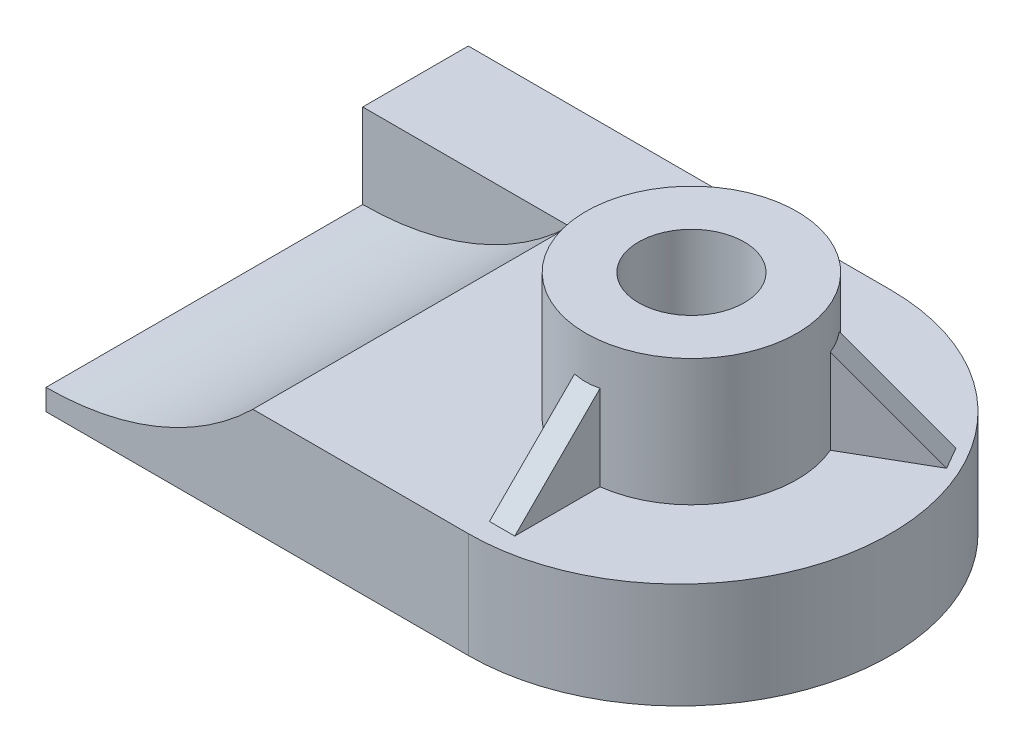
ISO-10303-21;
HEADER;
FILE_DESCRIPTION(('STEP AP214'),'2;1');
FILE_NAME('part.step','',(''),(''),'','','');
FILE_SCHEMA(('AUTOMOTIVE_DESIGN { 1 0 10303 214 1 1 1 1 }'));
ENDSEC;
DATA;
#1=APPLICATION_CONTEXT('core data for automotive mechanical design processes');
#2=APPLICATION_PROTOCOL_DEFINITION('international standard','automotive_design',2000,#1);
#3=PRODUCT_CONTEXT('',#1,'mechanical');
#4=PRODUCT('Part','Part','',(#3));
#5=PRODUCT_RELATED_PRODUCT_CATEGORY('part','',(#4));
#6=PRODUCT_DEFINITION_FORMATION('','',#4);
#7=PRODUCT_DEFINITION_CONTEXT('part definition',#1,'design');
#8=PRODUCT_DEFINITION('design','',#6,#7);
#9=PRODUCT_DEFINITION_SHAPE('','',#8);
#10=(LENGTH_UNIT() NAMED_UNIT(*) SI_UNIT(.MILLI.,.METRE.));
#11=(NAMED_UNIT(*) PLANE_ANGLE_UNIT() SI_UNIT($,.RADIAN.));
#12=(NAMED_UNIT(*) SI_UNIT($,.STERADIAN.) SOLID_ANGLE_UNIT());
#13=UNCERTAINTY_MEASURE_WITH_UNIT(LENGTH_MEASURE(1.E-05),#10,'distance_accuracy_value','');
#14=(GEOMETRIC_REPRESENTATION_CONTEXT(3) GLOBAL_UNCERTAINTY_ASSIGNED_CONTEXT((#13)) GLOBAL_UNIT_ASSIGNED_CONTEXT((#10,
#11,#12)) REPRESENTATION_CONTEXT('',''));
#15=CARTESIAN_POINT('',(0.,0.,0.));
#16=DIRECTION('',(0.,0.,1.));
#17=DIRECTION('',(1.,0.,0.));
#18=AXIS2_PLACEMENT_3D('',#15,#16,#17);
#19=CARTESIAN_POINT('',(50.,25.,0.));
#20=DIRECTION('',(0.,-1.,0.));
#21=DIRECTION('',(0.,0.,-1.));
#22=AXIS2_PLACEMENT_3D('',#19,#20,#21);
#23=CYLINDRICAL_SURFACE('',#22,50.);
#24=CARTESIAN_POINT('',(50.,0.,0.));
#25=DIRECTION('',(0.,1.,0.));
#26=DIRECTION('',(0.,0.,-1.));
#27=AXIS2_PLACEMENT_3D('',#24,#25,#26);
#28=CIRCLE('',#27,50.);
#29=CARTESIAN_POINT('',(50.,0.,50.));
#30=VERTEX_POINT('',#29);
#31=CARTESIAN_POINT('',(50.,0.,-50.));
#32=VERTEX_POINT('',#31);
#33=EDGE_CURVE('E261',#30,#32,#28,.T.);
#34=ORIENTED_EDGE('',*,*,#33,.T.);
#35=DIRECTION('',(0.,-1.,0.));
#36=VECTOR('',#35,1.);
#37=CARTESIAN_POINT('',(50.,25.,-50.));
#38=LINE('',#37,#36);
#39=CARTESIAN_POINT('',(50.,25.,-50.));
#40=VERTEX_POINT('',#39);
#41=EDGE_CURVE('E301',#40,#32,#38,.T.);
#42=ORIENTED_EDGE('',*,*,#41,.F.);
#43=CARTESIAN_POINT('',(50.,25.,0.));
#44=DIRECTION('',(0.,1.,0.));
#45=DIRECTION('',(0.,0.,-1.));
#46=AXIS2_PLACEMENT_3D('',#43,#44,#45);
#47=CIRCLE('',#46,50.);
#48=CARTESIAN_POINT('',(50.,25.,50.));
#49=VERTEX_POINT('',#48);
#50=EDGE_CURVE('E265',#49,#40,#47,.T.);
#51=ORIENTED_EDGE('',*,*,#50,.F.);
#52=DIRECTION('',(0.,-1.,0.));
#53=VECTOR('',#52,1.);
#54=CARTESIAN_POINT('',(50.,25.,50.));
#55=LINE('',#54,#53);
#56=EDGE_CURVE('E279',#49,#30,#55,.T.);
#57=ORIENTED_EDGE('',*,*,#56,.T.);
#58=EDGE_LOOP('',(#34,#42,#51,#57));
#59=FACE_BOUND('',#58,.T.);
#60=ADVANCED_FACE('F39',(#59),#23,.T.);
#61=CARTESIAN_POINT('',(-50.,25.,-50.));
#62=DIRECTION('',(0.,0.,1.));
#63=DIRECTION('',(1.,0.,0.));
#64=AXIS2_PLACEMENT_3D('',#61,#62,#63);
#65=PLANE('',#64);
#66=DIRECTION('',(-1.,0.,0.));
#67=VECTOR('',#66,1.);
#68=CARTESIAN_POINT('',(-50.,0.,-50.));
#69=LINE('',#68,#67);
#70=CARTESIAN_POINT('',(-50.,0.,-50.));
#71=VERTEX_POINT('',#70);
#72=EDGE_CURVE('E282',#32,#71,#69,.T.);
#73=ORIENTED_EDGE('',*,*,#72,.T.);
#74=DIRECTION('',(0.,-1.,0.));
#75=VECTOR('',#74,1.);
#76=CARTESIAN_POINT('',(-50.,25.,-50.));
#77=LINE('',#76,#75);
#78=CARTESIAN_POINT('',(-50.,25.,-50.));
#79=VERTEX_POINT('',#78);
#80=EDGE_CURVE('E297',#79,#71,#77,.T.);
#81=ORIENTED_EDGE('',*,*,#80,.F.);
#82=DIRECTION('',(-1.,0.,0.));
#83=VECTOR('',#82,1.);
#84=CARTESIAN_POINT('',(-50.,25.,-50.));
#85=LINE('',#84,#83);
#86=EDGE_CURVE('E268',#40,#79,#85,.T.);
#87=ORIENTED_EDGE('',*,*,#86,.F.);
#88=ORIENTED_EDGE('',*,*,#41,.T.);
#89=EDGE_LOOP('',(#73,#81,#87,#88));
#90=FACE_BOUND('',#89,.T.);
#91=ADVANCED_FACE('F332',(#90),#65,.F.);
#92=CARTESIAN_POINT('',(-50.,25.,-50.));
#93=DIRECTION('',(1.,0.,0.));
#94=DIRECTION('',(0.,0.,-1.));
#95=AXIS2_PLACEMENT_3D('',#92,#93,#94);
#96=PLANE('',#95);
#97=DIRECTION('',(0.,-1.,0.));
#98=VECTOR('',#97,1.);
#99=CARTESIAN_POINT('',(-50.,25.,50.));
#100=LINE('',#99,#98);
#101=CARTESIAN_POINT('',(-50.,5.,50.));
#102=VERTEX_POINT('',#101);
#103=CARTESIAN_POINT('',(-50.,0.,50.));
#104=VERTEX_POINT('',#103);
#105=EDGE_CURVE('E294',#102,#104,#100,.T.);
#106=ORIENTED_EDGE('',*,*,#105,.F.);
#107=DIRECTION('',(0.,0.,1.));
#108=VECTOR('',#107,1.);
#109=CARTESIAN_POINT('',(-50.,5.,-25.));
#110=LINE('',#109,#108);
#111=CARTESIAN_POINT('',(-50.,5.,-25.));
#112=VERTEX_POINT('',#111);
#113=EDGE_CURVE('E258',#112,#102,#110,.T.);
#114=ORIENTED_EDGE('',*,*,#113,.F.);
#115=DIRECTION('',(0.,-1.,0.));
#116=VECTOR('',#115,1.);
#117=CARTESIAN_POINT('',(-50.,25.,-25.));
#118=LINE('',#117,#116);
#119=CARTESIAN_POINT('',(-50.,25.,-25.));
#120=VERTEX_POINT('',#119);
#121=EDGE_CURVE('E251',#120,#112,#118,.T.);
#122=ORIENTED_EDGE('',*,*,#121,.F.);
#123=DIRECTION('',(0.,0.,1.));
#124=VECTOR('',#123,1.);
#125=CARTESIAN_POINT('',(-50.,25.,-50.));
#126=LINE('',#125,#124);
#127=EDGE_CURVE('E272',#79,#120,#126,.T.);
#128=ORIENTED_EDGE('',*,*,#127,.F.);
#129=ORIENTED_EDGE('',*,*,#80,.T.);
#130=DIRECTION('',(0.,0.,1.));
#131=VECTOR('',#130,1.);
#132=CARTESIAN_POINT('',(-50.,0.,-50.));
#133=LINE('',#132,#131);
#134=EDGE_CURVE('E285',#71,#104,#133,.T.);
#135=ORIENTED_EDGE('',*,*,#134,.T.);
#136=EDGE_LOOP('',(#106,#114,#122,#128,#129,#135));
#137=FACE_BOUND('',#136,.T.);
#138=ADVANCED_FACE('F337',(#137),#96,.F.);
#139=CARTESIAN_POINT('',(-50.,25.,50.));
#140=DIRECTION('',(0.,0.,-1.));
#141=DIRECTION('',(-1.,0.,0.));
#142=AXIS2_PLACEMENT_3D('',#139,#140,#141);
#143=PLANE('',#142);
#144=DIRECTION('',(1.,0.,0.));
#145=VECTOR('',#144,1.);
#146=CARTESIAN_POINT('',(-50.,0.,50.));
#147=LINE('',#146,#145);
#148=EDGE_CURVE('E269',#104,#30,#147,.T.);
#149=ORIENTED_EDGE('',*,*,#148,.T.);
#150=ORIENTED_EDGE('',*,*,#56,.F.);
#151=DIRECTION('',(1.,0.,0.));
#152=VECTOR('',#151,1.);
#153=CARTESIAN_POINT('',(-50.,25.,50.));
#154=LINE('',#153,#152);
#155=CARTESIAN_POINT('',(-1.01020514433643,25.,50.));
#156=VERTEX_POINT('',#155);
#157=EDGE_CURVE('E276',#156,#49,#154,.T.);
#158=ORIENTED_EDGE('',*,*,#157,.F.);
#159=CARTESIAN_POINT('',(-50.,75.,50.));
#160=DIRECTION('',(0.,0.,1.));
#161=DIRECTION('',(1.,0.,0.));
#162=AXIS2_PLACEMENT_3D('',#159,#160,#161);
#163=CIRCLE('',#162,70.);
#164=EDGE_CURVE('E244',#102,#156,#163,.T.);
#165=ORIENTED_EDGE('',*,*,#164,.F.);
#166=ORIENTED_EDGE('',*,*,#105,.T.);
#167=EDGE_LOOP('',(#149,#150,#158,#165,#166));
#168=FACE_BOUND('',#167,.T.);
#169=ADVANCED_FACE('F356',(#168),#143,.F.);
#170=CARTESIAN_POINT('',(50.,25.,0.));
#171=DIRECTION('',(0.,-1.,0.));
#172=DIRECTION('',(0.,0.,-1.));
#173=AXIS2_PLACEMENT_3D('',#170,#171,#172);
#174=PLANE('',#173);
#175=DIRECTION('',(0.866025403784436,0.,-0.500000000000004));
#176=VECTOR('',#175,1.);
#177=CARTESIAN_POINT('',(52.1292136145049,25.,3.6879061604898));
#178=LINE('',#177,#176);
#179=CARTESIAN_POINT('',(75.7690122011827,25.,-9.96053791711731));
#180=VERTEX_POINT('',#179);
#181=CARTESIAN_POINT('',(93.2295703993094,25.,-20.041395893007));
#182=VERTEX_POINT('',#181);
#183=EDGE_CURVE('E191',#180,#182,#178,.T.);
#184=ORIENTED_EDGE('',*,*,#183,.F.);
#185=CARTESIAN_POINT('',(52.8389514860065,25.,0.));
#186=DIRECTION('',(0.,-1.,0.));
#187=DIRECTION('',(0.,0.,-1.));
#188=AXIS2_PLACEMENT_3D('',#185,#186,#187);
#189=CIRCLE('',#188,25.);
#190=CARTESIAN_POINT('',(56.,25.,24.7993502393143));
#191=VERTEX_POINT('',#190);
#192=EDGE_CURVE('E153',#191,#180,#189,.F.);
#193=ORIENTED_EDGE('',*,*,#192,.F.);
#194=DIRECTION('',(0.,0.,1.));
#195=VECTOR('',#194,1.);
#196=CARTESIAN_POINT('',(56.,25.,0.));
#197=LINE('',#196,#195);
#198=CARTESIAN_POINT('',(56.,25.,45.));
#199=VERTEX_POINT('',#198);
#200=EDGE_CURVE('E223',#191,#199,#197,.T.);
#201=ORIENTED_EDGE('',*,*,#200,.T.);
#202=DIRECTION('',(-1.,0.,0.));
#203=VECTOR('',#202,1.);
#204=CARTESIAN_POINT('',(50.,25.,45.));
#205=LINE('',#204,#203);
#206=CARTESIAN_POINT('',(50.,25.,45.));
#207=VERTEX_POINT('',#206);
#208=EDGE_CURVE('E226',#199,#207,#205,.T.);
#209=ORIENTED_EDGE('',*,*,#208,.T.);
#210=DIRECTION('',(0.,0.,1.));
#211=VECTOR('',#210,1.);
#212=CARTESIAN_POINT('',(50.,25.,0.));
#213=LINE('',#212,#211);
#214=CARTESIAN_POINT('',(50.,25.,24.8382840482208));
#215=VERTEX_POINT('',#214);
#216=EDGE_CURVE('E215',#215,#207,#213,.T.);
#217=ORIENTED_EDGE('',*,*,#216,.F.);
#218=CARTESIAN_POINT('',(29.7815599244157,25.,-9.6621268039435));
#219=VERTEX_POINT('',#218);
#220=EDGE_CURVE('E154',#219,#215,#189,.F.);
#221=ORIENTED_EDGE('',*,*,#220,.F.);
#222=DIRECTION('',(-0.866025403784443,0.,-0.499999999999992));
#223=VECTOR('',#222,1.);
#224=CARTESIAN_POINT('',(49.1292136145049,25.,1.50824626221687));
#225=LINE('',#224,#223);
#226=CARTESIAN_POINT('',(12.2872840587098,25.,-19.7624516842862));
#227=VERTEX_POINT('',#226);
#228=EDGE_CURVE('E54',#219,#227,#225,.T.);
#229=ORIENTED_EDGE('',*,*,#228,.T.);
#230=DIRECTION('',(0.499999999999992,0.,-0.866025403784443));
#231=VECTOR('',#230,1.);
#232=CARTESIAN_POINT('',(13.1580704442049,25.,-21.2706979465031));
#233=LINE('',#232,#231);
#234=CARTESIAN_POINT('',(15.2872840587098,25.,-24.9586041069928));
#235=VERTEX_POINT('',#234);
#236=EDGE_CURVE('E58',#227,#235,#233,.T.);
#237=ORIENTED_EDGE('',*,*,#236,.T.);
#238=DIRECTION('',(-0.866025403784443,0.,-0.499999999999992));
#239=VECTOR('',#238,1.);
#240=CARTESIAN_POINT('',(52.1292136145048,25.,-3.68790616048979));
#241=LINE('',#240,#239);
#242=CARTESIAN_POINT('',(32.7478422568366,25.,-14.8777461311034));
#243=VERTEX_POINT('',#242);
#244=EDGE_CURVE('E156',#243,#235,#241,.T.);
#245=ORIENTED_EDGE('',*,*,#244,.F.);
#246=CARTESIAN_POINT('',(72.7352945336036,25.,-15.1372234353707));
#247=VERTEX_POINT('',#246);
#248=EDGE_CURVE('E144',#247,#243,#189,.F.);
#249=ORIENTED_EDGE('',*,*,#248,.F.);
#250=DIRECTION('',(0.866025403784436,0.,-0.500000000000004));
#251=VECTOR('',#250,1.);
#252=CARTESIAN_POINT('',(49.1292136145049,25.,-1.50824626221682));
#253=LINE('',#252,#251);
#254=CARTESIAN_POINT('',(90.2295703993093,25.,-25.2375483157136));
#255=VERTEX_POINT('',#254);
#256=EDGE_CURVE('E198',#247,#255,#253,.T.);
#257=ORIENTED_EDGE('',*,*,#256,.T.);
#258=DIRECTION('',(0.500000000000004,0.,0.866025403784436));
#259=VECTOR('',#258,1.);
#260=CARTESIAN_POINT('',(91.1003567848045,25.,-23.7293020534968));
#261=LINE('',#260,#259);
#262=EDGE_CURVE('E201',#255,#182,#261,.T.);
#263=ORIENTED_EDGE('',*,*,#262,.T.);
#264=EDGE_LOOP('',(#184,#193,#201,#209,#217,#221,#229,#237,#245,#249,#257,#263));
#265=FACE_BOUND('',#264,.T.);
#266=ORIENTED_EDGE('',*,*,#50,.T.);
#267=ORIENTED_EDGE('',*,*,#86,.T.);
#268=ORIENTED_EDGE('',*,*,#127,.T.);
#269=DIRECTION('',(-1.,0.,0.));
#270=VECTOR('',#269,1.);
#271=CARTESIAN_POINT('',(-1.01020514433643,25.,-25.));
#272=LINE('',#271,#270);
#273=CARTESIAN_POINT('',(-1.01020514433643,25.,-25.));
#274=VERTEX_POINT('',#273);
#275=EDGE_CURVE('E248',#274,#120,#272,.T.);
#276=ORIENTED_EDGE('',*,*,#275,.F.);
#277=DIRECTION('',(0.,0.,1.));
#278=VECTOR('',#277,1.);
#279=CARTESIAN_POINT('',(-1.01020514433643,25.,-25.));
#280=LINE('',#279,#278);
#281=EDGE_CURVE('E255',#274,#156,#280,.T.);
#282=ORIENTED_EDGE('',*,*,#281,.T.);
#283=ORIENTED_EDGE('',*,*,#157,.T.);
#284=EDGE_LOOP('',(#266,#267,#268,#276,#282,#283));
#285=FACE_BOUND('',#284,.T.);
#286=ADVANCED_FACE('F158',(#265,#285),#174,.F.);
#287=CARTESIAN_POINT('',(50.,0.,0.));
#288=DIRECTION('',(0.,-1.,0.));
#289=DIRECTION('',(0.,0.,-1.));
#290=AXIS2_PLACEMENT_3D('',#287,#288,#289);
#291=PLANE('',#290);
#292=ORIENTED_EDGE('',*,*,#72,.F.);
#293=ORIENTED_EDGE('',*,*,#33,.F.);
#294=ORIENTED_EDGE('',*,*,#148,.F.);
#295=ORIENTED_EDGE('',*,*,#134,.F.);
#296=EDGE_LOOP('',(#292,#293,#294,#295));
#297=FACE_BOUND('',#296,.T.);
#298=ADVANCED_FACE('F347',(#297),#291,.T.);
#299=CARTESIAN_POINT('',(-50.,75.,-25.));
#300=DIRECTION('',(0.,0.,1.));
#301=DIRECTION('',(1.,0.,0.));
#302=AXIS2_PLACEMENT_3D('',#299,#300,#301);
#303=CYLINDRICAL_SURFACE('',#302,70.);
#304=ORIENTED_EDGE('',*,*,#164,.T.);
#305=ORIENTED_EDGE('',*,*,#281,.F.);
#306=CARTESIAN_POINT('',(-50.,75.,-25.));
#307=DIRECTION('',(0.,0.,1.));
#308=DIRECTION('',(1.,0.,0.));
#309=AXIS2_PLACEMENT_3D('',#306,#307,#308);
#310=CIRCLE('',#309,70.);
#311=EDGE_CURVE('E245',#112,#274,#310,.T.);
#312=ORIENTED_EDGE('',*,*,#311,.F.);
#313=ORIENTED_EDGE('',*,*,#113,.T.);
#314=EDGE_LOOP('',(#304,#305,#312,#313));
#315=FACE_BOUND('',#314,.T.);
#316=ADVANCED_FACE('F364',(#315),#303,.F.);
#317=CARTESIAN_POINT('',(-50.,75.,-25.));
#318=DIRECTION('',(0.,0.,1.));
#319=DIRECTION('',(1.,0.,0.));
#320=AXIS2_PLACEMENT_3D('',#317,#318,#319);
#321=PLANE('',#320);
#322=ORIENTED_EDGE('',*,*,#311,.T.);
#323=ORIENTED_EDGE('',*,*,#275,.T.);
#324=ORIENTED_EDGE('',*,*,#121,.T.);
#325=EDGE_LOOP('',(#322,#323,#324));
#326=FACE_BOUND('',#325,.T.);
#327=ADVANCED_FACE('F362',(#326),#321,.T.);
#328=CARTESIAN_POINT('',(52.8389514860065,55.,0.));
#329=DIRECTION('',(0.,1.,0.));
#330=DIRECTION('',(0.,0.,1.));
#331=AXIS2_PLACEMENT_3D('',#328,#329,#330);
#332=PLANE('',#331);
#333=CARTESIAN_POINT('',(52.8389514860065,55.,0.));
#334=DIRECTION('',(0.,1.,0.));
#335=DIRECTION('',(0.,0.,1.));
#336=AXIS2_PLACEMENT_3D('',#333,#334,#335);
#337=CIRCLE('',#336,12.5);
#338=CARTESIAN_POINT('',(52.8389514860065,55.,12.5));
#339=VERTEX_POINT('',#338);
#340=EDGE_CURVE('E233',#339,#339,#337,.T.);
#341=ORIENTED_EDGE('',*,*,#340,.F.);
#342=EDGE_LOOP('',(#341));
#343=FACE_BOUND('',#342,.T.);
#344=CARTESIAN_POINT('',(52.8389514860065,55.,0.));
#345=DIRECTION('',(0.,1.,0.));
#346=DIRECTION('',(0.,0.,1.));
#347=AXIS2_PLACEMENT_3D('',#344,#345,#346);
#348=CIRCLE('',#347,25.);
#349=CARTESIAN_POINT('',(52.8389514860065,55.,25.));
#350=VERTEX_POINT('',#349);
#351=EDGE_CURVE('E237',#350,#350,#348,.T.);
#352=ORIENTED_EDGE('',*,*,#351,.T.);
#353=EDGE_LOOP('',(#352));
#354=FACE_BOUND('',#353,.T.);
#355=ADVANCED_FACE('F371',(#343,#354),#332,.T.);
#356=CARTESIAN_POINT('',(52.8389514860065,55.,0.));
#357=DIRECTION('',(0.,-1.,0.));
#358=DIRECTION('',(0.,0.,-1.));
#359=AXIS2_PLACEMENT_3D('',#356,#357,#358);
#360=CYLINDRICAL_SURFACE('',#359,25.);
#361=ORIENTED_EDGE('',*,*,#351,.F.);
#362=EDGE_LOOP('',(#361));
#363=FACE_BOUND('',#362,.T.);
#364=ORIENTED_EDGE('',*,*,#192,.T.);
#365=DIRECTION('',(0.,-1.,0.));
#366=VECTOR('',#365,1.);
#367=CARTESIAN_POINT('',(75.7690122011827,55.,-9.96053791711731));
#368=LINE('',#367,#366);
#369=CARTESIAN_POINT('',(75.7690122011827,45.1617159517792,-9.96053791711732));
#370=VERTEX_POINT('',#369);
#371=EDGE_CURVE('E187',#370,#180,#368,.T.);
#372=ORIENTED_EDGE('',*,*,#371,.F.);
#373=CARTESIAN_POINT('',(52.8389514860065,70.,0.));
#374=DIRECTION('',(0.612372435695793,0.707106781186548,-0.353553390593277));
#375=DIRECTION('',(0.612372435695793,-0.707106781186547,-0.353553390593277));
#376=AXIS2_PLACEMENT_3D('',#373,#374,#375);
#377=ELLIPSE('',#376,35.3553390593274,25.);
#378=CARTESIAN_POINT('',(72.7352945336035,45.2006497606857,-15.1372234353707));
#379=VERTEX_POINT('',#378);
#380=EDGE_CURVE('E47',#370,#379,#377,.T.);
#381=ORIENTED_EDGE('',*,*,#380,.T.);
#382=DIRECTION('',(0.,-1.,0.));
#383=VECTOR('',#382,1.);
#384=CARTESIAN_POINT('',(72.7352945336036,55.,-15.1372234353707));
#385=LINE('',#384,#383);
#386=EDGE_CURVE('E150',#379,#247,#385,.T.);
#387=ORIENTED_EDGE('',*,*,#386,.T.);
#388=ORIENTED_EDGE('',*,*,#248,.T.);
#389=DIRECTION('',(0.,-1.,0.));
#390=VECTOR('',#389,1.);
#391=CARTESIAN_POINT('',(32.7478422568366,55.,-14.8777461311034));
#392=LINE('',#391,#390);
#393=CARTESIAN_POINT('',(32.7478422568366,45.1617159517792,-14.8777461311034));
#394=VERTEX_POINT('',#393);
#395=EDGE_CURVE('E147',#394,#243,#392,.T.);
#396=ORIENTED_EDGE('',*,*,#395,.F.);
#397=CARTESIAN_POINT('',(52.8389514860065,70.,0.));
#398=DIRECTION('',(-0.612372435695798,0.707106781186548,-0.353553390593268));
#399=DIRECTION('',(-0.612372435695798,-0.707106781186548,-0.353553390593268));
#400=AXIS2_PLACEMENT_3D('',#397,#398,#399);
#401=ELLIPSE('',#400,35.3553390593274,25.);
#402=CARTESIAN_POINT('',(29.7815599244157,45.2006497606857,-9.66212680394351));
#403=VERTEX_POINT('',#402);
#404=EDGE_CURVE('E11',#394,#403,#401,.T.);
#405=ORIENTED_EDGE('',*,*,#404,.T.);
#406=DIRECTION('',(0.,-1.,0.));
#407=VECTOR('',#406,1.);
#408=CARTESIAN_POINT('',(29.7815599244157,55.,-9.66212680394351));
#409=LINE('',#408,#407);
#410=EDGE_CURVE('E164',#403,#219,#409,.T.);
#411=ORIENTED_EDGE('',*,*,#410,.T.);
#412=ORIENTED_EDGE('',*,*,#220,.T.);
#413=DIRECTION('',(0.,-1.,0.));
#414=VECTOR('',#413,1.);
#415=CARTESIAN_POINT('',(50.,55.,24.8382840482208));
#416=LINE('',#415,#414);
#417=CARTESIAN_POINT('',(50.,45.1617159517792,24.8382840482208));
#418=VERTEX_POINT('',#417);
#419=EDGE_CURVE('E211',#418,#215,#416,.T.);
#420=ORIENTED_EDGE('',*,*,#419,.F.);
#421=CARTESIAN_POINT('',(52.8389514860065,70.,0.));
#422=DIRECTION('',(0.,0.707106781186548,0.707106781186547));
#423=DIRECTION('',(0.,-0.707106781186547,0.707106781186548));
#424=AXIS2_PLACEMENT_3D('',#421,#422,#423);
#425=ELLIPSE('',#424,35.3553390593274,25.);
#426=CARTESIAN_POINT('',(56.,45.2006497606857,24.7993502393143));
#427=VERTEX_POINT('',#426);
#428=EDGE_CURVE('E306',#418,#427,#425,.T.);
#429=ORIENTED_EDGE('',*,*,#428,.T.);
#430=DIRECTION('',(0.,-1.,0.));
#431=VECTOR('',#430,1.);
#432=CARTESIAN_POINT('',(56.,55.,24.7993502393143));
#433=LINE('',#432,#431);
#434=EDGE_CURVE('E219',#427,#191,#433,.T.);
#435=ORIENTED_EDGE('',*,*,#434,.T.);
#436=EDGE_LOOP('',(#364,#372,#381,#387,#388,#396,#405,#411,#412,#420,#429,#435));
#437=FACE_BOUND('',#436,.T.);
#438=ADVANCED_FACE('F145',(#363,#437),#360,.T.);
#439=CARTESIAN_POINT('',(52.8389514860065,55.,0.));
#440=DIRECTION('',(0.,-1.,0.));
#441=DIRECTION('',(0.,0.,-1.));
#442=AXIS2_PLACEMENT_3D('',#439,#440,#441);
#443=CYLINDRICAL_SURFACE('',#442,12.5);
#444=CARTESIAN_POINT('',(52.8389514860065,25.,0.));
#445=DIRECTION('',(0.,1.,0.));
#446=DIRECTION('',(0.,0.,1.));
#447=AXIS2_PLACEMENT_3D('',#444,#445,#446);
#448=CIRCLE('',#447,12.5);
#449=CARTESIAN_POINT('',(52.8389514860065,25.,12.5));
#450=VERTEX_POINT('',#449);
#451=EDGE_CURVE('E232',#450,#450,#448,.T.);
#452=ORIENTED_EDGE('',*,*,#451,.F.);
#453=EDGE_LOOP('',(#452));
#454=FACE_BOUND('',#453,.T.);
#455=ORIENTED_EDGE('',*,*,#340,.T.);
#456=EDGE_LOOP('',(#455));
#457=FACE_BOUND('',#456,.T.);
#458=ADVANCED_FACE('F423',(#454,#457),#443,.F.);
#459=ORIENTED_EDGE('',*,*,#451,.T.);
#460=EDGE_LOOP('',(#459));
#461=FACE_BOUND('',#460,.T.);
#462=ADVANCED_FACE('F377',(#461),#174,.F.);
#463=CARTESIAN_POINT('',(53.,45.,25.));
#464=DIRECTION('',(0.,0.707106781186548,0.707106781186547));
#465=DIRECTION('',(0.,-0.707106781186547,0.707106781186548));
#466=AXIS2_PLACEMENT_3D('',#463,#464,#465);
#467=PLANE('',#466);
#468=ORIENTED_EDGE('',*,*,#208,.F.);
#469=DIRECTION('',(0.,-0.707106781186547,0.707106781186548));
#470=VECTOR('',#469,1.);
#471=CARTESIAN_POINT('',(56.,45.,25.));
#472=LINE('',#471,#470);
#473=EDGE_CURVE('E207',#427,#199,#472,.T.);
#474=ORIENTED_EDGE('',*,*,#473,.F.);
#475=ORIENTED_EDGE('',*,*,#428,.F.);
#476=DIRECTION('',(0.,-0.707106781186547,0.707106781186548));
#477=VECTOR('',#476,1.);
#478=CARTESIAN_POINT('',(50.,45.,25.));
#479=LINE('',#478,#477);
#480=EDGE_CURVE('E206',#418,#207,#479,.T.);
#481=ORIENTED_EDGE('',*,*,#480,.T.);
#482=EDGE_LOOP('',(#468,#474,#475,#481));
#483=FACE_BOUND('',#482,.T.);
#484=ADVANCED_FACE('F441',(#483),#467,.T.);
#485=CARTESIAN_POINT('',(56.,27.5,0.));
#486=DIRECTION('',(1.,0.,0.));
#487=DIRECTION('',(0.,0.,-1.));
#488=AXIS2_PLACEMENT_3D('',#485,#486,#487);
#489=PLANE('',#488);
#490=ORIENTED_EDGE('',*,*,#200,.F.);
#491=ORIENTED_EDGE('',*,*,#434,.F.);
#492=ORIENTED_EDGE('',*,*,#473,.T.);
#493=EDGE_LOOP('',(#490,#491,#492));
#494=FACE_BOUND('',#493,.T.);
#495=ADVANCED_FACE('F503',(#494),#489,.T.);
#496=CARTESIAN_POINT('',(50.,27.5,0.));
#497=DIRECTION('',(1.,0.,0.));
#498=DIRECTION('',(0.,0.,-1.));
#499=AXIS2_PLACEMENT_3D('',#496,#497,#498);
#500=PLANE('',#499);
#501=ORIENTED_EDGE('',*,*,#419,.T.);
#502=ORIENTED_EDGE('',*,*,#216,.T.);
#503=ORIENTED_EDGE('',*,*,#480,.F.);
#504=EDGE_LOOP('',(#501,#502,#503));
#505=FACE_BOUND('',#504,.T.);
#506=ADVANCED_FACE('F451',(#505),#500,.F.);
#507=CARTESIAN_POINT('',(74.4090623236206,45.,-12.6394721043602));
#508=DIRECTION('',(0.612372435695793,0.707106781186548,-0.353553390593277));
#509=DIRECTION('',(0.612372435695793,-0.707106781186547,-0.353553390593277));
#510=AXIS2_PLACEMENT_3D('',#507,#508,#509);
#511=PLANE('',#510);
#512=ORIENTED_EDGE('',*,*,#262,.F.);
#513=DIRECTION('',(0.612372435695793,-0.707106781186547,-0.353553390593277));
#514=VECTOR('',#513,1.);
#515=CARTESIAN_POINT('',(72.9090623236206,45.,-15.2375483157135));
#516=LINE('',#515,#514);
#517=EDGE_CURVE('E183',#379,#255,#516,.T.);
#518=ORIENTED_EDGE('',*,*,#517,.F.);
#519=ORIENTED_EDGE('',*,*,#380,.F.);
#520=DIRECTION('',(0.612372435695793,-0.707106781186547,-0.353553390593277));
#521=VECTOR('',#520,1.);
#522=CARTESIAN_POINT('',(75.9090623236206,45.,-10.0413958930069));
#523=LINE('',#522,#521);
#524=EDGE_CURVE('E182',#370,#182,#523,.T.);
#525=ORIENTED_EDGE('',*,*,#524,.T.);
#526=EDGE_LOOP('',(#512,#518,#519,#525));
#527=FACE_BOUND('',#526,.T.);
#528=ADVANCED_FACE('F316',(#527),#511,.T.);
#529=CARTESIAN_POINT('',(30.379213614505,27.5,9.31707128508872));
#530=DIRECTION('',(-0.500000000000004,0.,-0.866025403784436));
#531=DIRECTION('',(-0.866025403784436,0.,0.500000000000004));
#532=AXIS2_PLACEMENT_3D('',#529,#530,#531);
#533=PLANE('',#532);
#534=ORIENTED_EDGE('',*,*,#256,.F.);
#535=ORIENTED_EDGE('',*,*,#386,.F.);
#536=ORIENTED_EDGE('',*,*,#517,.T.);
#537=EDGE_LOOP('',(#534,#535,#536));
#538=FACE_BOUND('',#537,.T.);
#539=ADVANCED_FACE('F314',(#538),#533,.T.);
#540=CARTESIAN_POINT('',(33.379213614505,27.5,14.5132237077953));
#541=DIRECTION('',(-0.500000000000004,0.,-0.866025403784436));
#542=DIRECTION('',(-0.866025403784436,0.,0.500000000000004));
#543=AXIS2_PLACEMENT_3D('',#540,#541,#542);
#544=PLANE('',#543);
#545=ORIENTED_EDGE('',*,*,#371,.T.);
#546=ORIENTED_EDGE('',*,*,#183,.T.);
#547=ORIENTED_EDGE('',*,*,#524,.F.);
#548=EDGE_LOOP('',(#545,#546,#547));
#549=FACE_BOUND('',#548,.T.);
#550=ADVANCED_FACE('F318',(#549),#544,.F.);
#551=CARTESIAN_POINT('',(31.1077921343986,45.,-12.3605278956397));
#552=DIRECTION('',(-0.612372435695798,0.707106781186548,-0.353553390593268));
#553=DIRECTION('',(-0.612372435695798,-0.707106781186547,-0.353553390593268));
#554=AXIS2_PLACEMENT_3D('',#551,#552,#553);
#555=PLANE('',#554);
#556=ORIENTED_EDGE('',*,*,#236,.F.);
#557=DIRECTION('',(-0.612372435695798,-0.707106781186547,-0.353553390593268));
#558=VECTOR('',#557,1.);
#559=CARTESIAN_POINT('',(29.6077921343987,45.,-9.76245168428635));
#560=LINE('',#559,#558);
#561=EDGE_CURVE('E169',#403,#227,#560,.T.);
#562=ORIENTED_EDGE('',*,*,#561,.F.);
#563=ORIENTED_EDGE('',*,*,#404,.F.);
#564=DIRECTION('',(-0.612372435695798,-0.707106781186547,-0.353553390593268));
#565=VECTOR('',#564,1.);
#566=CARTESIAN_POINT('',(32.6077921343986,45.,-14.958604106993));
#567=LINE('',#566,#565);
#568=EDGE_CURVE('E167',#394,#235,#567,.T.);
#569=ORIENTED_EDGE('',*,*,#568,.T.);
#570=EDGE_LOOP('',(#556,#562,#563,#569));
#571=FACE_BOUND('',#570,.T.);
#572=ADVANCED_FACE('F320',(#571),#555,.T.);
#573=CARTESIAN_POINT('',(30.3792136145047,27.5,-9.3170712850885));
#574=DIRECTION('',(-0.499999999999992,0.,0.866025403784443));
#575=DIRECTION('',(0.866025403784443,0.,0.499999999999992));
#576=AXIS2_PLACEMENT_3D('',#573,#574,#575);
#577=PLANE('',#576);
#578=ORIENTED_EDGE('',*,*,#228,.F.);
#579=ORIENTED_EDGE('',*,*,#410,.F.);
#580=ORIENTED_EDGE('',*,*,#561,.T.);
#581=EDGE_LOOP('',(#578,#579,#580));
#582=FACE_BOUND('',#581,.T.);
#583=ADVANCED_FACE('F326',(#582),#577,.T.);
#584=CARTESIAN_POINT('',(33.3792136145046,27.5,-14.5132237077952));
#585=DIRECTION('',(-0.499999999999992,0.,0.866025403784443));
#586=DIRECTION('',(0.866025403784443,0.,0.499999999999992));
#587=AXIS2_PLACEMENT_3D('',#584,#585,#586);
#588=PLANE('',#587);
#589=ORIENTED_EDGE('',*,*,#395,.T.);
#590=ORIENTED_EDGE('',*,*,#244,.T.);
#591=ORIENTED_EDGE('',*,*,#568,.F.);
#592=EDGE_LOOP('',(#589,#590,#591));
#593=FACE_BOUND('',#592,.T.);
#594=ADVANCED_FACE('F166',(#593),#588,.F.);
#595=CLOSED_SHELL('',(#60,#91,#138,#169,#286,#298,#316,#327,#355,#438,#458,#462,#484,#495,#506,
#528,#539,#550,#572,#583,#594));
#596=MANIFOLD_SOLID_BREP('B2',#595);
#597=ADVANCED_BREP_SHAPE_REPRESENTATION('',(#18,#596),#14);
#598=SHAPE_DEFINITION_REPRESENTATION(#9,#597);
ENDSEC;
END-ISO-10303-21;
